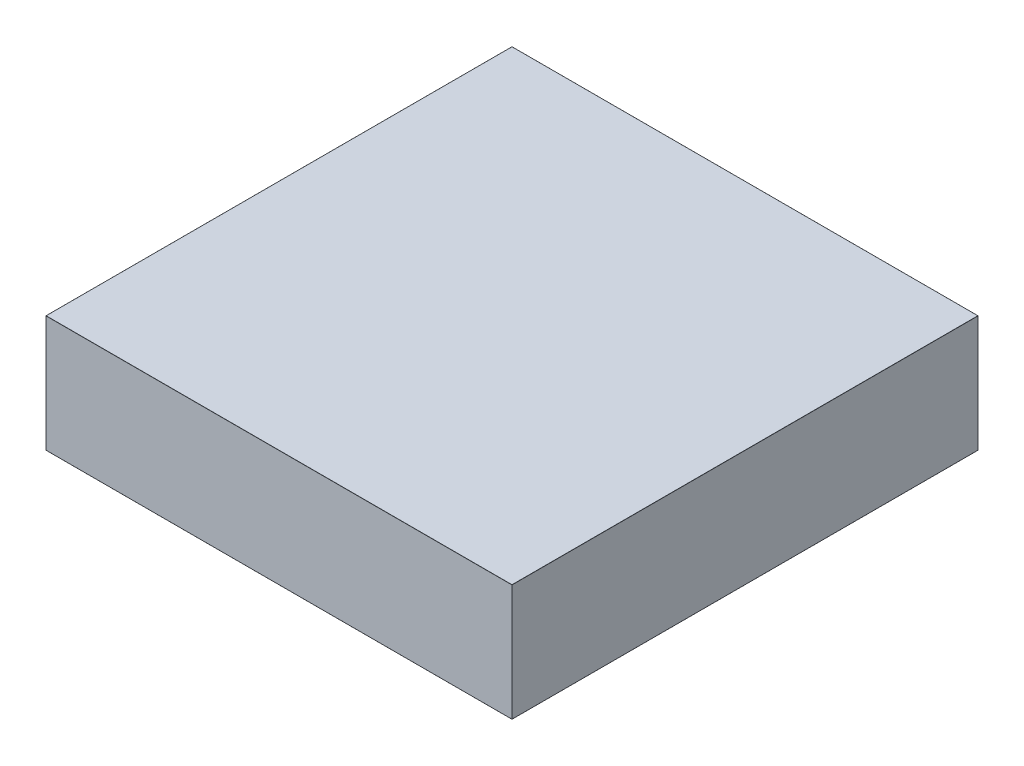
ISO-10303-21;
HEADER;
FILE_DESCRIPTION(('STEP AP214'),'2;1');
FILE_NAME('part.step','',(''),(''),'','','');
FILE_SCHEMA(('AUTOMOTIVE_DESIGN { 1 0 10303 214 1 1 1 1 }'));
ENDSEC;
DATA;
#1=APPLICATION_CONTEXT('core data for automotive mechanical design processes');
#2=APPLICATION_PROTOCOL_DEFINITION('international standard','automotive_design',2000,#1);
#3=PRODUCT_CONTEXT('',#1,'mechanical');
#4=PRODUCT('Part','Part','',(#3));
#5=PRODUCT_RELATED_PRODUCT_CATEGORY('part','',(#4));
#6=PRODUCT_DEFINITION_FORMATION('','',#4);
#7=PRODUCT_DEFINITION_CONTEXT('part definition',#1,'design');
#8=PRODUCT_DEFINITION('design','',#6,#7);
#9=PRODUCT_DEFINITION_SHAPE('','',#8);
#10=(LENGTH_UNIT() NAMED_UNIT(*) SI_UNIT(.MILLI.,.METRE.));
#11=(NAMED_UNIT(*) PLANE_ANGLE_UNIT() SI_UNIT($,.RADIAN.));
#12=(NAMED_UNIT(*) SI_UNIT($,.STERADIAN.) SOLID_ANGLE_UNIT());
#13=UNCERTAINTY_MEASURE_WITH_UNIT(LENGTH_MEASURE(1.E-05),#10,'distance_accuracy_value','');
#14=(GEOMETRIC_REPRESENTATION_CONTEXT(3) GLOBAL_UNCERTAINTY_ASSIGNED_CONTEXT((#13)) GLOBAL_UNIT_ASSIGNED_CONTEXT((#10,
#11,#12)) REPRESENTATION_CONTEXT('',''));
#15=CARTESIAN_POINT('',(0.,0.,0.));
#16=DIRECTION('',(0.,0.,1.));
#17=DIRECTION('',(1.,0.,0.));
#18=AXIS2_PLACEMENT_3D('',#15,#16,#17);
#19=CARTESIAN_POINT('',(200.,-50.,200.));
#20=DIRECTION('',(-1.,0.,0.));
#21=DIRECTION('',(0.,0.,1.));
#22=AXIS2_PLACEMENT_3D('',#19,#20,#21);
#23=PLANE('',#22);
#24=DIRECTION('',(0.,1.,0.));
#25=VECTOR('',#24,1.);
#26=CARTESIAN_POINT('',(200.,-50.,199.9));
#27=LINE('',#26,#25);
#28=CARTESIAN_POINT('',(200.,49.9,199.9));
#29=VERTEX_POINT('',#28);
#30=CARTESIAN_POINT('',(200.,-49.9,199.9));
#31=VERTEX_POINT('',#30);
#32=EDGE_CURVE('E183',#29,#31,#27,.F.);
#33=ORIENTED_EDGE('',*,*,#32,.T.);
#34=DIRECTION('',(0.,0.,-1.));
#35=VECTOR('',#34,1.);
#36=CARTESIAN_POINT('',(200.,-49.9,200.));
#37=LINE('',#36,#35);
#38=CARTESIAN_POINT('',(200.,-49.9,-199.9));
#39=VERTEX_POINT('',#38);
#40=EDGE_CURVE('E187',#31,#39,#37,.T.);
#41=ORIENTED_EDGE('',*,*,#40,.T.);
#42=DIRECTION('',(0.,1.,0.));
#43=VECTOR('',#42,1.);
#44=CARTESIAN_POINT('',(200.,50.,-199.9));
#45=LINE('',#44,#43);
#46=CARTESIAN_POINT('',(200.,49.9,-199.9));
#47=VERTEX_POINT('',#46);
#48=EDGE_CURVE('E185',#39,#47,#45,.T.);
#49=ORIENTED_EDGE('',*,*,#48,.T.);
#50=DIRECTION('',(0.,0.,-1.));
#51=VECTOR('',#50,1.);
#52=CARTESIAN_POINT('',(200.,49.9,200.));
#53=LINE('',#52,#51);
#54=EDGE_CURVE('E181',#47,#29,#53,.F.);
#55=ORIENTED_EDGE('',*,*,#54,.T.);
#56=EDGE_LOOP('',(#33,#41,#49,#55));
#57=FACE_BOUND('',#56,.T.);
#58=ADVANCED_FACE('F33',(#57),#23,.F.);
#59=CARTESIAN_POINT('',(-200.,50.,200.));
#60=DIRECTION('',(0.,-1.,0.));
#61=DIRECTION('',(0.,0.,-1.));
#62=AXIS2_PLACEMENT_3D('',#59,#60,#61);
#63=PLANE('',#62);
#64=DIRECTION('',(-1.,0.,0.));
#65=VECTOR('',#64,1.);
#66=CARTESIAN_POINT('',(-200.,50.,199.9));
#67=LINE('',#66,#65);
#68=CARTESIAN_POINT('',(-199.9,50.,199.9));
#69=VERTEX_POINT('',#68);
#70=CARTESIAN_POINT('',(199.9,50.,199.9));
#71=VERTEX_POINT('',#70);
#72=EDGE_CURVE('E42',#69,#71,#67,.F.);
#73=ORIENTED_EDGE('',*,*,#72,.T.);
#74=DIRECTION('',(0.,0.,-1.));
#75=VECTOR('',#74,1.);
#76=CARTESIAN_POINT('',(199.9,50.,200.));
#77=LINE('',#76,#75);
#78=CARTESIAN_POINT('',(199.9,50.,-199.9));
#79=VERTEX_POINT('',#78);
#80=EDGE_CURVE('E11',#71,#79,#77,.T.);
#81=ORIENTED_EDGE('',*,*,#80,.T.);
#82=DIRECTION('',(-1.,0.,0.));
#83=VECTOR('',#82,1.);
#84=CARTESIAN_POINT('',(-200.,50.,-199.9));
#85=LINE('',#84,#83);
#86=CARTESIAN_POINT('',(-199.9,50.,-199.9));
#87=VERTEX_POINT('',#86);
#88=EDGE_CURVE('E198',#79,#87,#85,.T.);
#89=ORIENTED_EDGE('',*,*,#88,.T.);
#90=DIRECTION('',(0.,0.,-1.));
#91=VECTOR('',#90,1.);
#92=CARTESIAN_POINT('',(-199.9,50.,200.));
#93=LINE('',#92,#91);
#94=EDGE_CURVE('E53',#87,#69,#93,.F.);
#95=ORIENTED_EDGE('',*,*,#94,.T.);
#96=EDGE_LOOP('',(#73,#81,#89,#95));
#97=FACE_BOUND('',#96,.T.);
#98=ADVANCED_FACE('F292',(#97),#63,.F.);
#99=CARTESIAN_POINT('',(-200.,-50.,200.));
#100=DIRECTION('',(1.,0.,0.));
#101=DIRECTION('',(0.,0.,-1.));
#102=AXIS2_PLACEMENT_3D('',#99,#100,#101);
#103=PLANE('',#102);
#104=DIRECTION('',(0.,0.,-1.));
#105=VECTOR('',#104,1.);
#106=CARTESIAN_POINT('',(-200.,49.9,200.));
#107=LINE('',#106,#105);
#108=CARTESIAN_POINT('',(-200.,49.9,199.9));
#109=VERTEX_POINT('',#108);
#110=CARTESIAN_POINT('',(-200.,49.9,-199.9));
#111=VERTEX_POINT('',#110);
#112=EDGE_CURVE('E125',#109,#111,#107,.T.);
#113=ORIENTED_EDGE('',*,*,#112,.T.);
#114=DIRECTION('',(0.,-1.,0.));
#115=VECTOR('',#114,1.);
#116=CARTESIAN_POINT('',(-200.,-50.,-199.9));
#117=LINE('',#116,#115);
#118=CARTESIAN_POINT('',(-200.,-49.9,-199.9));
#119=VERTEX_POINT('',#118);
#120=EDGE_CURVE('E161',#111,#119,#117,.T.);
#121=ORIENTED_EDGE('',*,*,#120,.T.);
#122=DIRECTION('',(0.,0.,-1.));
#123=VECTOR('',#122,1.);
#124=CARTESIAN_POINT('',(-200.,-49.9,200.));
#125=LINE('',#124,#123);
#126=CARTESIAN_POINT('',(-200.,-49.9,199.9));
#127=VERTEX_POINT('',#126);
#128=EDGE_CURVE('E128',#119,#127,#125,.F.);
#129=ORIENTED_EDGE('',*,*,#128,.T.);
#130=DIRECTION('',(0.,-1.,0.));
#131=VECTOR('',#130,1.);
#132=CARTESIAN_POINT('',(-200.,-50.,199.9));
#133=LINE('',#132,#131);
#134=EDGE_CURVE('E120',#127,#109,#133,.F.);
#135=ORIENTED_EDGE('',*,*,#134,.T.);
#136=EDGE_LOOP('',(#113,#121,#129,#135));
#137=FACE_BOUND('',#136,.T.);
#138=ADVANCED_FACE('F122',(#137),#103,.F.);
#139=CARTESIAN_POINT('',(-200.,-50.,200.));
#140=DIRECTION('',(0.,1.,0.));
#141=DIRECTION('',(0.,0.,1.));
#142=AXIS2_PLACEMENT_3D('',#139,#140,#141);
#143=PLANE('',#142);
#144=DIRECTION('',(1.,0.,0.));
#145=VECTOR('',#144,1.);
#146=CARTESIAN_POINT('',(-200.,-50.,199.9));
#147=LINE('',#146,#145);
#148=CARTESIAN_POINT('',(199.9,-50.,199.9));
#149=VERTEX_POINT('',#148);
#150=CARTESIAN_POINT('',(-199.9,-50.,199.9));
#151=VERTEX_POINT('',#150);
#152=EDGE_CURVE('E172',#149,#151,#147,.F.);
#153=ORIENTED_EDGE('',*,*,#152,.T.);
#154=DIRECTION('',(0.,0.,-1.));
#155=VECTOR('',#154,1.);
#156=CARTESIAN_POINT('',(-199.9,-50.,200.));
#157=LINE('',#156,#155);
#158=CARTESIAN_POINT('',(-199.9,-50.,-199.9));
#159=VERTEX_POINT('',#158);
#160=EDGE_CURVE('E178',#151,#159,#157,.T.);
#161=ORIENTED_EDGE('',*,*,#160,.T.);
#162=DIRECTION('',(1.,0.,0.));
#163=VECTOR('',#162,1.);
#164=CARTESIAN_POINT('',(200.,-50.,-199.9));
#165=LINE('',#164,#163);
#166=CARTESIAN_POINT('',(199.9,-50.,-199.9));
#167=VERTEX_POINT('',#166);
#168=EDGE_CURVE('E176',#159,#167,#165,.T.);
#169=ORIENTED_EDGE('',*,*,#168,.T.);
#170=DIRECTION('',(0.,0.,-1.));
#171=VECTOR('',#170,1.);
#172=CARTESIAN_POINT('',(199.9,-50.,200.));
#173=LINE('',#172,#171);
#174=EDGE_CURVE('E174',#167,#149,#173,.F.);
#175=ORIENTED_EDGE('',*,*,#174,.T.);
#176=EDGE_LOOP('',(#153,#161,#169,#175));
#177=FACE_BOUND('',#176,.T.);
#178=ADVANCED_FACE('F275',(#177),#143,.F.);
#179=CARTESIAN_POINT('',(0.,0.,200.));
#180=DIRECTION('',(0.,0.,-1.));
#181=DIRECTION('',(-1.,0.,0.));
#182=AXIS2_PLACEMENT_3D('',#179,#180,#181);
#183=PLANE('',#182);
#184=DIRECTION('',(0.,-1.,0.));
#185=VECTOR('',#184,1.);
#186=CARTESIAN_POINT('',(-199.9,0.,200.));
#187=LINE('',#186,#185);
#188=CARTESIAN_POINT('',(-199.9,49.9,200.));
#189=VERTEX_POINT('',#188);
#190=CARTESIAN_POINT('',(-199.9,-49.9,200.));
#191=VERTEX_POINT('',#190);
#192=EDGE_CURVE('E138',#189,#191,#187,.T.);
#193=ORIENTED_EDGE('',*,*,#192,.T.);
#194=DIRECTION('',(1.,0.,0.));
#195=VECTOR('',#194,1.);
#196=CARTESIAN_POINT('',(0.,-49.9,200.));
#197=LINE('',#196,#195);
#198=CARTESIAN_POINT('',(199.9,-49.9,200.));
#199=VERTEX_POINT('',#198);
#200=EDGE_CURVE('E195',#191,#199,#197,.T.);
#201=ORIENTED_EDGE('',*,*,#200,.T.);
#202=DIRECTION('',(0.,1.,0.));
#203=VECTOR('',#202,1.);
#204=CARTESIAN_POINT('',(199.9,0.,200.));
#205=LINE('',#204,#203);
#206=CARTESIAN_POINT('',(199.9,49.9,200.));
#207=VERTEX_POINT('',#206);
#208=EDGE_CURVE('E192',#199,#207,#205,.T.);
#209=ORIENTED_EDGE('',*,*,#208,.T.);
#210=DIRECTION('',(-1.,0.,0.));
#211=VECTOR('',#210,1.);
#212=CARTESIAN_POINT('',(0.,49.9,200.));
#213=LINE('',#212,#211);
#214=EDGE_CURVE('E190',#207,#189,#213,.T.);
#215=ORIENTED_EDGE('',*,*,#214,.T.);
#216=EDGE_LOOP('',(#193,#201,#209,#215));
#217=FACE_BOUND('',#216,.T.);
#218=ADVANCED_FACE('F262',(#217),#183,.F.);
#219=CARTESIAN_POINT('',(0.,0.,-200.));
#220=DIRECTION('',(0.,0.,-1.));
#221=DIRECTION('',(-1.,0.,0.));
#222=AXIS2_PLACEMENT_3D('',#219,#220,#221);
#223=PLANE('',#222);
#224=DIRECTION('',(1.,0.,0.));
#225=VECTOR('',#224,1.);
#226=CARTESIAN_POINT('',(-200.,-49.9,-200.));
#227=LINE('',#226,#225);
#228=CARTESIAN_POINT('',(199.9,-49.9,-200.));
#229=VERTEX_POINT('',#228);
#230=CARTESIAN_POINT('',(-199.9,-49.9,-200.));
#231=VERTEX_POINT('',#230);
#232=EDGE_CURVE('E167',#229,#231,#227,.F.);
#233=ORIENTED_EDGE('',*,*,#232,.T.);
#234=DIRECTION('',(0.,-1.,0.));
#235=VECTOR('',#234,1.);
#236=CARTESIAN_POINT('',(-199.9,50.,-200.));
#237=LINE('',#236,#235);
#238=CARTESIAN_POINT('',(-199.9,49.9,-200.));
#239=VERTEX_POINT('',#238);
#240=EDGE_CURVE('E169',#231,#239,#237,.F.);
#241=ORIENTED_EDGE('',*,*,#240,.T.);
#242=DIRECTION('',(-1.,0.,0.));
#243=VECTOR('',#242,1.);
#244=CARTESIAN_POINT('',(200.,49.9,-200.));
#245=LINE('',#244,#243);
#246=CARTESIAN_POINT('',(199.9,49.9,-200.));
#247=VERTEX_POINT('',#246);
#248=EDGE_CURVE('E163',#239,#247,#245,.F.);
#249=ORIENTED_EDGE('',*,*,#248,.T.);
#250=DIRECTION('',(0.,1.,0.));
#251=VECTOR('',#250,1.);
#252=CARTESIAN_POINT('',(199.9,-50.,-200.));
#253=LINE('',#252,#251);
#254=EDGE_CURVE('E165',#247,#229,#253,.F.);
#255=ORIENTED_EDGE('',*,*,#254,.T.);
#256=EDGE_LOOP('',(#233,#241,#249,#255));
#257=FACE_BOUND('',#256,.T.);
#258=ADVANCED_FACE('F478',(#257),#223,.T.);
#259=CARTESIAN_POINT('',(199.9,0.,199.9));
#260=DIRECTION('',(0.,1.,0.));
#261=DIRECTION('',(0.,0.,1.));
#262=AXIS2_PLACEMENT_3D('',#259,#260,#261);
#263=CYLINDRICAL_SURFACE('',#262,0.1);
#264=CARTESIAN_POINT('',(199.9,49.9,199.9));
#265=DIRECTION('',(0.,1.,0.));
#266=DIRECTION('',(0.,0.,1.));
#267=AXIS2_PLACEMENT_3D('',#264,#265,#266);
#268=CIRCLE('',#267,0.1);
#269=EDGE_CURVE('E37',#207,#29,#268,.T.);
#270=ORIENTED_EDGE('',*,*,#269,.F.);
#271=ORIENTED_EDGE('',*,*,#208,.F.);
#272=CARTESIAN_POINT('',(199.9,-49.9,199.9));
#273=DIRECTION('',(0.,-1.,0.));
#274=DIRECTION('',(0.,0.,-1.));
#275=AXIS2_PLACEMENT_3D('',#272,#273,#274);
#276=CIRCLE('',#275,0.1);
#277=EDGE_CURVE('E158',#31,#199,#276,.T.);
#278=ORIENTED_EDGE('',*,*,#277,.F.);
#279=ORIENTED_EDGE('',*,*,#32,.F.);
#280=EDGE_LOOP('',(#270,#271,#278,#279));
#281=FACE_BOUND('',#280,.T.);
#282=ADVANCED_FACE('F35',(#281),#263,.T.);
#283=CARTESIAN_POINT('',(199.9,49.9,199.9));
#284=DIRECTION('',(0.,0.,1.));
#285=DIRECTION('',(1.,0.,0.));
#286=AXIS2_PLACEMENT_3D('',#283,#284,#285);
#287=SPHERICAL_SURFACE('',#286,0.1);
#288=CARTESIAN_POINT('',(199.9,49.9,199.9));
#289=DIRECTION('',(1.,0.,-2.7755575615632E-13));
#290=DIRECTION('',(-2.7755575615632E-13,0.,-1.));
#291=AXIS2_PLACEMENT_3D('',#288,#289,#290);
#292=CIRCLE('',#291,0.1);
#293=EDGE_CURVE('E243',#207,#71,#292,.F.);
#294=ORIENTED_EDGE('',*,*,#293,.F.);
#295=ORIENTED_EDGE('',*,*,#269,.T.);
#296=CARTESIAN_POINT('',(199.9,49.9,199.9));
#297=DIRECTION('',(0.,0.,1.));
#298=DIRECTION('',(1.,0.,0.));
#299=AXIS2_PLACEMENT_3D('',#296,#297,#298);
#300=CIRCLE('',#299,0.1);
#301=EDGE_CURVE('E245',#71,#29,#300,.F.);
#302=ORIENTED_EDGE('',*,*,#301,.F.);
#303=EDGE_LOOP('',(#294,#295,#302));
#304=FACE_BOUND('',#303,.T.);
#305=ADVANCED_FACE('F285',(#304),#287,.T.);
#306=CARTESIAN_POINT('',(199.9,-49.9,199.9));
#307=DIRECTION('',(0.,0.,1.));
#308=DIRECTION('',(1.,0.,0.));
#309=AXIS2_PLACEMENT_3D('',#306,#307,#308);
#310=SPHERICAL_SURFACE('',#309,0.1);
#311=CARTESIAN_POINT('',(199.9,-49.9,199.9));
#312=DIRECTION('',(0.,0.,1.));
#313=DIRECTION('',(1.,0.,0.));
#314=AXIS2_PLACEMENT_3D('',#311,#312,#313);
#315=CIRCLE('',#314,0.1);
#316=EDGE_CURVE('E238',#31,#149,#315,.F.);
#317=ORIENTED_EDGE('',*,*,#316,.F.);
#318=ORIENTED_EDGE('',*,*,#277,.T.);
#319=CARTESIAN_POINT('',(199.9,-49.9,199.9));
#320=DIRECTION('',(1.,0.,0.));
#321=DIRECTION('',(0.,0.,-1.));
#322=AXIS2_PLACEMENT_3D('',#319,#320,#321);
#323=CIRCLE('',#322,0.1);
#324=EDGE_CURVE('E241',#149,#199,#323,.F.);
#325=ORIENTED_EDGE('',*,*,#324,.F.);
#326=EDGE_LOOP('',(#317,#318,#325));
#327=FACE_BOUND('',#326,.T.);
#328=ADVANCED_FACE('F253',(#327),#310,.T.);
#329=CARTESIAN_POINT('',(199.9,49.9,200.));
#330=DIRECTION('',(0.,0.,-1.));
#331=DIRECTION('',(-1.,0.,0.));
#332=AXIS2_PLACEMENT_3D('',#329,#330,#331);
#333=CYLINDRICAL_SURFACE('',#332,0.1);
#334=ORIENTED_EDGE('',*,*,#301,.T.);
#335=ORIENTED_EDGE('',*,*,#54,.F.);
#336=CARTESIAN_POINT('',(199.9,49.9,-199.9));
#337=DIRECTION('',(0.,0.,-1.));
#338=DIRECTION('',(-1.,0.,0.));
#339=AXIS2_PLACEMENT_3D('',#336,#337,#338);
#340=CIRCLE('',#339,0.1);
#341=EDGE_CURVE('E232',#79,#47,#340,.T.);
#342=ORIENTED_EDGE('',*,*,#341,.F.);
#343=ORIENTED_EDGE('',*,*,#80,.F.);
#344=EDGE_LOOP('',(#334,#335,#342,#343));
#345=FACE_BOUND('',#344,.T.);
#346=ADVANCED_FACE('F289',(#345),#333,.T.);
#347=CARTESIAN_POINT('',(0.,49.9,199.9));
#348=DIRECTION('',(-1.,0.,0.));
#349=DIRECTION('',(0.,0.,1.));
#350=AXIS2_PLACEMENT_3D('',#347,#348,#349);
#351=CYLINDRICAL_SURFACE('',#350,0.1);
#352=ORIENTED_EDGE('',*,*,#293,.T.);
#353=ORIENTED_EDGE('',*,*,#72,.F.);
#354=CARTESIAN_POINT('',(-199.9,49.9,199.9));
#355=DIRECTION('',(-1.,0.,0.));
#356=DIRECTION('',(0.,0.,1.));
#357=AXIS2_PLACEMENT_3D('',#354,#355,#356);
#358=CIRCLE('',#357,0.1);
#359=EDGE_CURVE('E142',#189,#69,#358,.T.);
#360=ORIENTED_EDGE('',*,*,#359,.F.);
#361=ORIENTED_EDGE('',*,*,#214,.F.);
#362=EDGE_LOOP('',(#352,#353,#360,#361));
#363=FACE_BOUND('',#362,.T.);
#364=ADVANCED_FACE('F442',(#363),#351,.T.);
#365=CARTESIAN_POINT('',(-199.9,0.,199.9));
#366=DIRECTION('',(0.,-1.,0.));
#367=DIRECTION('',(0.,0.,-1.));
#368=AXIS2_PLACEMENT_3D('',#365,#366,#367);
#369=CYLINDRICAL_SURFACE('',#368,0.1);
#370=CARTESIAN_POINT('',(-199.9,-49.9,199.9));
#371=DIRECTION('',(0.,-1.,0.));
#372=DIRECTION('',(0.,0.,-1.));
#373=AXIS2_PLACEMENT_3D('',#370,#371,#372);
#374=CIRCLE('',#373,0.1);
#375=EDGE_CURVE('E143',#191,#127,#374,.T.);
#376=ORIENTED_EDGE('',*,*,#375,.F.);
#377=ORIENTED_EDGE('',*,*,#192,.F.);
#378=CARTESIAN_POINT('',(-199.9,49.9,199.9));
#379=DIRECTION('',(0.,1.,0.));
#380=DIRECTION('',(0.,0.,1.));
#381=AXIS2_PLACEMENT_3D('',#378,#379,#380);
#382=CIRCLE('',#381,0.1);
#383=EDGE_CURVE('E135',#109,#189,#382,.T.);
#384=ORIENTED_EDGE('',*,*,#383,.F.);
#385=ORIENTED_EDGE('',*,*,#134,.F.);
#386=EDGE_LOOP('',(#376,#377,#384,#385));
#387=FACE_BOUND('',#386,.T.);
#388=ADVANCED_FACE('F137',(#387),#369,.T.);
#389=CARTESIAN_POINT('',(0.,-49.9,199.9));
#390=DIRECTION('',(1.,0.,0.));
#391=DIRECTION('',(0.,0.,-1.));
#392=AXIS2_PLACEMENT_3D('',#389,#390,#391);
#393=CYLINDRICAL_SURFACE('',#392,0.1);
#394=ORIENTED_EDGE('',*,*,#324,.T.);
#395=ORIENTED_EDGE('',*,*,#200,.F.);
#396=CARTESIAN_POINT('',(-199.9,-49.9,199.9));
#397=DIRECTION('',(-1.,0.,0.));
#398=DIRECTION('',(0.,0.,1.));
#399=AXIS2_PLACEMENT_3D('',#396,#397,#398);
#400=CIRCLE('',#399,0.1);
#401=EDGE_CURVE('E227',#151,#191,#400,.T.);
#402=ORIENTED_EDGE('',*,*,#401,.F.);
#403=ORIENTED_EDGE('',*,*,#152,.F.);
#404=EDGE_LOOP('',(#394,#395,#402,#403));
#405=FACE_BOUND('',#404,.T.);
#406=ADVANCED_FACE('F265',(#405),#393,.T.);
#407=CARTESIAN_POINT('',(199.9,-49.9,200.));
#408=DIRECTION('',(0.,0.,-1.));
#409=DIRECTION('',(-1.,0.,0.));
#410=AXIS2_PLACEMENT_3D('',#407,#408,#409);
#411=CYLINDRICAL_SURFACE('',#410,0.1);
#412=ORIENTED_EDGE('',*,*,#316,.T.);
#413=ORIENTED_EDGE('',*,*,#174,.F.);
#414=CARTESIAN_POINT('',(199.9,-49.9,-199.9));
#415=DIRECTION('',(0.,0.,-1.));
#416=DIRECTION('',(-1.,0.,0.));
#417=AXIS2_PLACEMENT_3D('',#414,#415,#416);
#418=CIRCLE('',#417,0.1);
#419=EDGE_CURVE('E224',#39,#167,#418,.T.);
#420=ORIENTED_EDGE('',*,*,#419,.F.);
#421=ORIENTED_EDGE('',*,*,#40,.F.);
#422=EDGE_LOOP('',(#412,#413,#420,#421));
#423=FACE_BOUND('',#422,.T.);
#424=ADVANCED_FACE('F279',(#423),#411,.T.);
#425=CARTESIAN_POINT('',(199.9,-50.,-199.9));
#426=DIRECTION('',(0.,-1.,0.));
#427=DIRECTION('',(0.,0.,-1.));
#428=AXIS2_PLACEMENT_3D('',#425,#426,#427);
#429=CYLINDRICAL_SURFACE('',#428,0.1);
#430=CARTESIAN_POINT('',(199.9,49.9,-199.9));
#431=DIRECTION('',(0.,1.,0.));
#432=DIRECTION('',(0.,0.,1.));
#433=AXIS2_PLACEMENT_3D('',#430,#431,#432);
#434=CIRCLE('',#433,0.1);
#435=EDGE_CURVE('E235',#47,#247,#434,.T.);
#436=ORIENTED_EDGE('',*,*,#435,.F.);
#437=ORIENTED_EDGE('',*,*,#48,.F.);
#438=CARTESIAN_POINT('',(199.9,-49.9,-199.9));
#439=DIRECTION('',(0.,-1.,0.));
#440=DIRECTION('',(0.,0.,-1.));
#441=AXIS2_PLACEMENT_3D('',#438,#439,#440);
#442=CIRCLE('',#441,0.1);
#443=EDGE_CURVE('E222',#229,#39,#442,.T.);
#444=ORIENTED_EDGE('',*,*,#443,.F.);
#445=ORIENTED_EDGE('',*,*,#254,.F.);
#446=EDGE_LOOP('',(#436,#437,#444,#445));
#447=FACE_BOUND('',#446,.T.);
#448=ADVANCED_FACE('F317',(#447),#429,.T.);
#449=CARTESIAN_POINT('',(199.9,49.9,-199.9));
#450=DIRECTION('',(0.,0.,1.));
#451=DIRECTION('',(1.,0.,0.));
#452=AXIS2_PLACEMENT_3D('',#449,#450,#451);
#453=SPHERICAL_SURFACE('',#452,0.1);
#454=ORIENTED_EDGE('',*,*,#341,.T.);
#455=ORIENTED_EDGE('',*,*,#435,.T.);
#456=CARTESIAN_POINT('',(199.9,49.9,-199.9));
#457=DIRECTION('',(1.,2.77555756156281E-13,0.));
#458=DIRECTION('',(-2.77555756156281E-13,1.,0.));
#459=AXIS2_PLACEMENT_3D('',#456,#457,#458);
#460=CIRCLE('',#459,0.1);
#461=EDGE_CURVE('E149',#79,#247,#460,.F.);
#462=ORIENTED_EDGE('',*,*,#461,.F.);
#463=EDGE_LOOP('',(#454,#455,#462));
#464=FACE_BOUND('',#463,.T.);
#465=ADVANCED_FACE('F319',(#464),#453,.T.);
#466=CARTESIAN_POINT('',(-199.9,49.9,199.9));
#467=DIRECTION('',(0.,0.,1.));
#468=DIRECTION('',(1.,0.,0.));
#469=AXIS2_PLACEMENT_3D('',#466,#467,#468);
#470=SPHERICAL_SURFACE('',#469,0.1);
#471=ORIENTED_EDGE('',*,*,#383,.T.);
#472=ORIENTED_EDGE('',*,*,#359,.T.);
#473=CARTESIAN_POINT('',(-199.9,49.9,199.9));
#474=DIRECTION('',(0.,0.,1.));
#475=DIRECTION('',(1.,0.,0.));
#476=AXIS2_PLACEMENT_3D('',#473,#474,#475);
#477=CIRCLE('',#476,0.1);
#478=EDGE_CURVE('E146',#109,#69,#477,.F.);
#479=ORIENTED_EDGE('',*,*,#478,.F.);
#480=EDGE_LOOP('',(#471,#472,#479));
#481=FACE_BOUND('',#480,.T.);
#482=ADVANCED_FACE('F147',(#481),#470,.T.);
#483=CARTESIAN_POINT('',(-199.9,-49.9,199.9));
#484=DIRECTION('',(0.,0.,1.));
#485=DIRECTION('',(1.,0.,0.));
#486=AXIS2_PLACEMENT_3D('',#483,#484,#485);
#487=SPHERICAL_SURFACE('',#486,0.1);
#488=ORIENTED_EDGE('',*,*,#401,.T.);
#489=ORIENTED_EDGE('',*,*,#375,.T.);
#490=CARTESIAN_POINT('',(-199.9,-49.9,199.9));
#491=DIRECTION('',(0.,0.,1.));
#492=DIRECTION('',(1.,0.,0.));
#493=AXIS2_PLACEMENT_3D('',#490,#491,#492);
#494=CIRCLE('',#493,0.1);
#495=EDGE_CURVE('E150',#151,#127,#494,.F.);
#496=ORIENTED_EDGE('',*,*,#495,.F.);
#497=EDGE_LOOP('',(#488,#489,#496));
#498=FACE_BOUND('',#497,.T.);
#499=ADVANCED_FACE('F268',(#498),#487,.T.);
#500=CARTESIAN_POINT('',(199.9,-49.9,-199.9));
#501=DIRECTION('',(0.,0.,1.));
#502=DIRECTION('',(1.,0.,0.));
#503=AXIS2_PLACEMENT_3D('',#500,#501,#502);
#504=SPHERICAL_SURFACE('',#503,0.1);
#505=ORIENTED_EDGE('',*,*,#443,.T.);
#506=ORIENTED_EDGE('',*,*,#419,.T.);
#507=CARTESIAN_POINT('',(199.9,-49.9,-199.9));
#508=DIRECTION('',(1.,0.,0.));
#509=DIRECTION('',(0.,0.,-1.));
#510=AXIS2_PLACEMENT_3D('',#507,#508,#509);
#511=CIRCLE('',#510,0.1);
#512=EDGE_CURVE('E215',#229,#167,#511,.F.);
#513=ORIENTED_EDGE('',*,*,#512,.F.);
#514=EDGE_LOOP('',(#505,#506,#513));
#515=FACE_BOUND('',#514,.T.);
#516=ADVANCED_FACE('F313',(#515),#504,.T.);
#517=CARTESIAN_POINT('',(-200.,49.9,-199.9));
#518=DIRECTION('',(1.,0.,0.));
#519=DIRECTION('',(0.,0.,-1.));
#520=AXIS2_PLACEMENT_3D('',#517,#518,#519);
#521=CYLINDRICAL_SURFACE('',#520,0.1);
#522=ORIENTED_EDGE('',*,*,#461,.T.);
#523=ORIENTED_EDGE('',*,*,#248,.F.);
#524=CARTESIAN_POINT('',(-199.9,49.9,-199.9));
#525=DIRECTION('',(-1.,0.,0.));
#526=DIRECTION('',(0.,0.,1.));
#527=AXIS2_PLACEMENT_3D('',#524,#525,#526);
#528=CIRCLE('',#527,0.1);
#529=EDGE_CURVE('E212',#87,#239,#528,.T.);
#530=ORIENTED_EDGE('',*,*,#529,.F.);
#531=ORIENTED_EDGE('',*,*,#88,.F.);
#532=EDGE_LOOP('',(#522,#523,#530,#531));
#533=FACE_BOUND('',#532,.T.);
#534=ADVANCED_FACE('F297',(#533),#521,.T.);
#535=CARTESIAN_POINT('',(-199.9,49.9,200.));
#536=DIRECTION('',(0.,0.,-1.));
#537=DIRECTION('',(-1.,0.,0.));
#538=AXIS2_PLACEMENT_3D('',#535,#536,#537);
#539=CYLINDRICAL_SURFACE('',#538,0.1);
#540=ORIENTED_EDGE('',*,*,#478,.T.);
#541=ORIENTED_EDGE('',*,*,#94,.F.);
#542=CARTESIAN_POINT('',(-199.9,49.9,-199.9));
#543=DIRECTION('',(0.,0.,-1.));
#544=DIRECTION('',(-1.,0.,0.));
#545=AXIS2_PLACEMENT_3D('',#542,#543,#544);
#546=CIRCLE('',#545,0.1);
#547=EDGE_CURVE('E154',#111,#87,#546,.T.);
#548=ORIENTED_EDGE('',*,*,#547,.F.);
#549=ORIENTED_EDGE('',*,*,#112,.F.);
#550=EDGE_LOOP('',(#540,#541,#548,#549));
#551=FACE_BOUND('',#550,.T.);
#552=ADVANCED_FACE('F152',(#551),#539,.T.);
#553=CARTESIAN_POINT('',(-199.9,-49.9,200.));
#554=DIRECTION('',(0.,0.,-1.));
#555=DIRECTION('',(-1.,0.,0.));
#556=AXIS2_PLACEMENT_3D('',#553,#554,#555);
#557=CYLINDRICAL_SURFACE('',#556,0.1);
#558=ORIENTED_EDGE('',*,*,#495,.T.);
#559=ORIENTED_EDGE('',*,*,#128,.F.);
#560=CARTESIAN_POINT('',(-199.9,-49.9,-199.9));
#561=DIRECTION('',(0.,0.,-1.));
#562=DIRECTION('',(-1.,0.,0.));
#563=AXIS2_PLACEMENT_3D('',#560,#561,#562);
#564=CIRCLE('',#563,0.1);
#565=EDGE_CURVE('E208',#159,#119,#564,.T.);
#566=ORIENTED_EDGE('',*,*,#565,.F.);
#567=ORIENTED_EDGE('',*,*,#160,.F.);
#568=EDGE_LOOP('',(#558,#559,#566,#567));
#569=FACE_BOUND('',#568,.T.);
#570=ADVANCED_FACE('F272',(#569),#557,.T.);
#571=CARTESIAN_POINT('',(-200.,-49.9,-199.9));
#572=DIRECTION('',(-1.,0.,0.));
#573=DIRECTION('',(0.,0.,1.));
#574=AXIS2_PLACEMENT_3D('',#571,#572,#573);
#575=CYLINDRICAL_SURFACE('',#574,0.1);
#576=ORIENTED_EDGE('',*,*,#512,.T.);
#577=ORIENTED_EDGE('',*,*,#168,.F.);
#578=CARTESIAN_POINT('',(-199.9,-49.9,-199.9));
#579=DIRECTION('',(-1.,0.,0.));
#580=DIRECTION('',(0.,0.,1.));
#581=AXIS2_PLACEMENT_3D('',#578,#579,#580);
#582=CIRCLE('',#581,0.1);
#583=EDGE_CURVE('E206',#231,#159,#582,.T.);
#584=ORIENTED_EDGE('',*,*,#583,.F.);
#585=ORIENTED_EDGE('',*,*,#232,.F.);
#586=EDGE_LOOP('',(#576,#577,#584,#585));
#587=FACE_BOUND('',#586,.T.);
#588=ADVANCED_FACE('F310',(#587),#575,.T.);
#589=CARTESIAN_POINT('',(-199.9,49.9,-199.9));
#590=DIRECTION('',(0.,0.,1.));
#591=DIRECTION('',(1.,0.,0.));
#592=AXIS2_PLACEMENT_3D('',#589,#590,#591);
#593=SPHERICAL_SURFACE('',#592,0.1);
#594=ORIENTED_EDGE('',*,*,#547,.T.);
#595=ORIENTED_EDGE('',*,*,#529,.T.);
#596=CARTESIAN_POINT('',(-199.9,49.9,-199.9));
#597=DIRECTION('',(0.,1.,0.));
#598=DIRECTION('',(0.,0.,1.));
#599=AXIS2_PLACEMENT_3D('',#596,#597,#598);
#600=CIRCLE('',#599,0.1);
#601=EDGE_CURVE('E204',#111,#239,#600,.F.);
#602=ORIENTED_EDGE('',*,*,#601,.F.);
#603=EDGE_LOOP('',(#594,#595,#602));
#604=FACE_BOUND('',#603,.T.);
#605=ADVANCED_FACE('F299',(#604),#593,.T.);
#606=CARTESIAN_POINT('',(-199.9,-49.9,-199.9));
#607=DIRECTION('',(0.,0.,1.));
#608=DIRECTION('',(1.,0.,0.));
#609=AXIS2_PLACEMENT_3D('',#606,#607,#608);
#610=SPHERICAL_SURFACE('',#609,0.1);
#611=ORIENTED_EDGE('',*,*,#583,.T.);
#612=ORIENTED_EDGE('',*,*,#565,.T.);
#613=CARTESIAN_POINT('',(-199.9,-49.9,-199.9));
#614=DIRECTION('',(0.,-1.,0.));
#615=DIRECTION('',(0.,0.,-1.));
#616=AXIS2_PLACEMENT_3D('',#613,#614,#615);
#617=CIRCLE('',#616,0.1);
#618=EDGE_CURVE('E202',#231,#119,#617,.F.);
#619=ORIENTED_EDGE('',*,*,#618,.F.);
#620=EDGE_LOOP('',(#611,#612,#619));
#621=FACE_BOUND('',#620,.T.);
#622=ADVANCED_FACE('F306',(#621),#610,.T.);
#623=CARTESIAN_POINT('',(-199.9,-50.,-199.9));
#624=DIRECTION('',(0.,1.,0.));
#625=DIRECTION('',(0.,0.,1.));
#626=AXIS2_PLACEMENT_3D('',#623,#624,#625);
#627=CYLINDRICAL_SURFACE('',#626,0.1);
#628=ORIENTED_EDGE('',*,*,#601,.T.);
#629=ORIENTED_EDGE('',*,*,#240,.F.);
#630=ORIENTED_EDGE('',*,*,#618,.T.);
#631=ORIENTED_EDGE('',*,*,#120,.F.);
#632=EDGE_LOOP('',(#628,#629,#630,#631));
#633=FACE_BOUND('',#632,.T.);
#634=ADVANCED_FACE('F303',(#633),#627,.T.);
#635=CLOSED_SHELL('',(#58,#98,#138,#178,#218,#258,#282,#305,#328,#346,#364,#388,#406,#424,#448,
#465,#482,#499,#516,#534,#552,#570,#588,#605,#622,#634));
#636=MANIFOLD_SOLID_BREP('B2',#635);
#637=ADVANCED_BREP_SHAPE_REPRESENTATION('',(#18,#636),#14);
#638=SHAPE_DEFINITION_REPRESENTATION(#9,#637);
ENDSEC;
END-ISO-10303-21;
